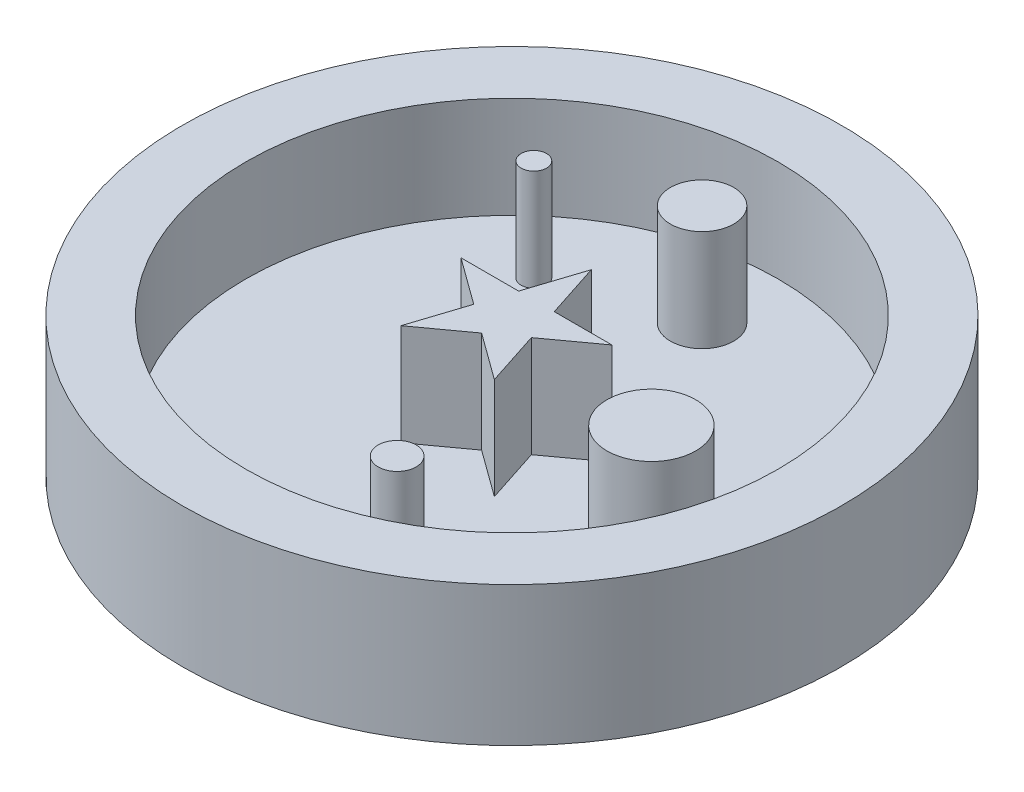
ISO-10303-21;
HEADER;
FILE_DESCRIPTION(('STEP AP214'),'2;1');
FILE_NAME('part.step','',(''),(''),'','','');
FILE_SCHEMA(('AUTOMOTIVE_DESIGN { 1 0 10303 214 1 1 1 1 }'));
ENDSEC;
DATA;
#1=APPLICATION_CONTEXT('core data for automotive mechanical design processes');
#2=APPLICATION_PROTOCOL_DEFINITION('international standard','automotive_design',2000,#1);
#3=PRODUCT_CONTEXT('',#1,'mechanical');
#4=PRODUCT('Part','Part','',(#3));
#5=PRODUCT_RELATED_PRODUCT_CATEGORY('part','',(#4));
#6=PRODUCT_DEFINITION_FORMATION('','',#4);
#7=PRODUCT_DEFINITION_CONTEXT('part definition',#1,'design');
#8=PRODUCT_DEFINITION('design','',#6,#7);
#9=PRODUCT_DEFINITION_SHAPE('','',#8);
#10=(LENGTH_UNIT() NAMED_UNIT(*) SI_UNIT(.MILLI.,.METRE.));
#11=(NAMED_UNIT(*) PLANE_ANGLE_UNIT() SI_UNIT($,.RADIAN.));
#12=(NAMED_UNIT(*) SI_UNIT($,.STERADIAN.) SOLID_ANGLE_UNIT());
#13=UNCERTAINTY_MEASURE_WITH_UNIT(LENGTH_MEASURE(1.E-05),#10,'distance_accuracy_value','');
#14=(GEOMETRIC_REPRESENTATION_CONTEXT(3) GLOBAL_UNCERTAINTY_ASSIGNED_CONTEXT((#13)) GLOBAL_UNIT_ASSIGNED_CONTEXT((#10,
#11,#12)) REPRESENTATION_CONTEXT('',''));
#15=CARTESIAN_POINT('',(0.,0.,0.));
#16=DIRECTION('',(0.,0.,1.));
#17=DIRECTION('',(1.,0.,0.));
#18=AXIS2_PLACEMENT_3D('',#15,#16,#17);
#19=CARTESIAN_POINT('',(0.,3.,0.));
#20=DIRECTION('',(0.,1.,0.));
#21=DIRECTION('',(0.,0.,1.));
#22=AXIS2_PLACEMENT_3D('',#19,#20,#21);
#23=PLANE('',#22);
#24=CARTESIAN_POINT('',(5.06448216423323,3.,14.1191720864987));
#25=DIRECTION('',(0.,1.,0.));
#26=DIRECTION('',(0.,0.,1.));
#27=AXIS2_PLACEMENT_3D('',#24,#25,#26);
#28=CIRCLE('',#27,1.5);
#29=CARTESIAN_POINT('',(5.06448216423323,3.,15.6191720864987));
#30=VERTEX_POINT('',#29);
#31=EDGE_CURVE('E296',#30,#30,#28,.T.);
#32=ORIENTED_EDGE('',*,*,#31,.F.);
#33=EDGE_LOOP('',(#32));
#34=FACE_BOUND('',#33,.T.);
#35=CARTESIAN_POINT('',(13.,3.,2.));
#36=DIRECTION('',(0.,1.,0.));
#37=DIRECTION('',(0.,0.,1.));
#38=AXIS2_PLACEMENT_3D('',#35,#36,#37);
#39=CIRCLE('',#38,3.5);
#40=CARTESIAN_POINT('',(13.,3.,5.5));
#41=VERTEX_POINT('',#40);
#42=EDGE_CURVE('E295',#41,#41,#39,.T.);
#43=ORIENTED_EDGE('',*,*,#42,.F.);
#44=EDGE_LOOP('',(#43));
#45=FACE_BOUND('',#44,.T.);
#46=CARTESIAN_POINT('',(0.,3.,-15.));
#47=DIRECTION('',(0.,1.,0.));
#48=DIRECTION('',(0.,0.,1.));
#49=AXIS2_PLACEMENT_3D('',#46,#47,#48);
#50=CIRCLE('',#49,2.5);
#51=CARTESIAN_POINT('',(0.,3.,-12.5));
#52=VERTEX_POINT('',#51);
#53=EDGE_CURVE('E305',#52,#52,#50,.T.);
#54=ORIENTED_EDGE('',*,*,#53,.F.);
#55=EDGE_LOOP('',(#54));
#56=FACE_BOUND('',#55,.T.);
#57=CARTESIAN_POINT('',(-9.70671974269708,3.,-11.4358905134989));
#58=DIRECTION('',(0.,1.,0.));
#59=DIRECTION('',(0.,0.,1.));
#60=AXIS2_PLACEMENT_3D('',#57,#58,#59);
#61=CIRCLE('',#60,1.);
#62=CARTESIAN_POINT('',(-9.70671974269708,3.,-10.4358905134989));
#63=VERTEX_POINT('',#62);
#64=EDGE_CURVE('E310',#63,#63,#61,.T.);
#65=ORIENTED_EDGE('',*,*,#64,.F.);
#66=EDGE_LOOP('',(#65));
#67=FACE_BOUND('',#66,.T.);
#68=CARTESIAN_POINT('',(0.,3.,0.));
#69=DIRECTION('',(0.,1.,0.));
#70=DIRECTION('',(0.,0.,1.));
#71=AXIS2_PLACEMENT_3D('',#68,#69,#70);
#72=CIRCLE('',#71,21.);
#73=CARTESIAN_POINT('',(0.,3.,21.));
#74=VERTEX_POINT('',#73);
#75=EDGE_CURVE('E189',#74,#74,#72,.T.);
#76=ORIENTED_EDGE('',*,*,#75,.T.);
#77=EDGE_LOOP('',(#76));
#78=FACE_BOUND('',#77,.T.);
#79=DIRECTION('',(-0.309016994374948,0.,0.951056516295153));
#80=VECTOR('',#79,1.);
#81=CARTESIAN_POINT('',(0.,3.,-6.26099033699941));
#82=LINE('',#81,#80);
#83=CARTESIAN_POINT('',(0.,3.,-6.26099033699941));
#84=VERTEX_POINT('',#83);
#85=CARTESIAN_POINT('',(-1.40567991120359,3.,-1.93475241575015));
#86=VERTEX_POINT('',#85);
#87=EDGE_CURVE('E150',#84,#86,#82,.T.);
#88=ORIENTED_EDGE('',*,*,#87,.F.);
#89=DIRECTION('',(-0.309016994374948,0.,-0.951056516295154));
#90=VECTOR('',#89,1.);
#91=CARTESIAN_POINT('',(1.40567991120359,3.,-1.93475241575015));
#92=LINE('',#91,#90);
#93=CARTESIAN_POINT('',(1.40567991120359,3.,-1.93475241575015));
#94=VERTEX_POINT('',#93);
#95=EDGE_CURVE('E147',#94,#84,#92,.T.);
#96=ORIENTED_EDGE('',*,*,#95,.F.);
#97=DIRECTION('',(-1.,0.,0.));
#98=VECTOR('',#97,1.);
#99=CARTESIAN_POINT('',(5.95455565846428,3.,-1.93475241575015));
#100=LINE('',#99,#98);
#101=CARTESIAN_POINT('',(5.95455565846428,3.,-1.93475241575015));
#102=VERTEX_POINT('',#101);
#103=EDGE_CURVE('E94',#102,#94,#100,.T.);
#104=ORIENTED_EDGE('',*,*,#103,.F.);
#105=DIRECTION('',(0.809016994374947,0.,-0.587785252292473));
#106=VECTOR('',#105,1.);
#107=CARTESIAN_POINT('',(2.27443787363034,3.,0.739009663000589));
#108=LINE('',#107,#106);
#109=CARTESIAN_POINT('',(2.27443787363034,3.,0.739009663000589));
#110=VERTEX_POINT('',#109);
#111=EDGE_CURVE('E164',#110,#102,#108,.T.);
#112=ORIENTED_EDGE('',*,*,#111,.F.);
#113=DIRECTION('',(-0.309016994374947,0.,-0.951056516295154));
#114=VECTOR('',#113,1.);
#115=CARTESIAN_POINT('',(3.68011778483393,3.,5.06524758424985));
#116=LINE('',#115,#114);
#117=CARTESIAN_POINT('',(3.68011778483393,3.,5.06524758424985));
#118=VERTEX_POINT('',#117);
#119=EDGE_CURVE('E136',#118,#110,#116,.T.);
#120=ORIENTED_EDGE('',*,*,#119,.F.);
#121=DIRECTION('',(0.809016994374947,0.,0.587785252292473));
#122=VECTOR('',#121,1.);
#123=CARTESIAN_POINT('',(0.,3.,2.39148550549912));
#124=LINE('',#123,#122);
#125=CARTESIAN_POINT('',(0.,3.,2.39148550549912));
#126=VERTEX_POINT('',#125);
#127=EDGE_CURVE('E161',#126,#118,#124,.T.);
#128=ORIENTED_EDGE('',*,*,#127,.F.);
#129=DIRECTION('',(0.809016994374947,0.,-0.587785252292473));
#130=VECTOR('',#129,1.);
#131=CARTESIAN_POINT('',(-3.68011778483394,3.,5.06524758424985));
#132=LINE('',#131,#130);
#133=CARTESIAN_POINT('',(-3.68011778483394,3.,5.06524758424985));
#134=VERTEX_POINT('',#133);
#135=EDGE_CURVE('E159',#134,#126,#132,.T.);
#136=ORIENTED_EDGE('',*,*,#135,.F.);
#137=DIRECTION('',(-0.309016994374948,0.,0.951056516295154));
#138=VECTOR('',#137,1.);
#139=CARTESIAN_POINT('',(-2.27443787363035,3.,0.739009663000588));
#140=LINE('',#139,#138);
#141=CARTESIAN_POINT('',(-2.27443787363035,3.,0.739009663000588));
#142=VERTEX_POINT('',#141);
#143=EDGE_CURVE('E157',#142,#134,#140,.T.);
#144=ORIENTED_EDGE('',*,*,#143,.F.);
#145=DIRECTION('',(0.809016994374947,0.,0.587785252292473));
#146=VECTOR('',#145,1.);
#147=CARTESIAN_POINT('',(-5.95455565846428,3.,-1.93475241575015));
#148=LINE('',#147,#146);
#149=CARTESIAN_POINT('',(-5.95455565846428,3.,-1.93475241575015));
#150=VERTEX_POINT('',#149);
#151=EDGE_CURVE('E155',#150,#142,#148,.T.);
#152=ORIENTED_EDGE('',*,*,#151,.F.);
#153=DIRECTION('',(-1.,0.,0.));
#154=VECTOR('',#153,1.);
#155=CARTESIAN_POINT('',(-1.40567991120359,3.,-1.93475241575015));
#156=LINE('',#155,#154);
#157=EDGE_CURVE('E153',#86,#150,#156,.T.);
#158=ORIENTED_EDGE('',*,*,#157,.F.);
#159=EDGE_LOOP('',(#88,#96,#104,#112,#120,#128,#136,#144,#152,#158));
#160=FACE_BOUND('',#159,.T.);
#161=ADVANCED_FACE('F39',(#34,#45,#56,#67,#78,#160),#23,.T.);
#162=CARTESIAN_POINT('',(0.,11.,0.));
#163=DIRECTION('',(0.,-1.,0.));
#164=DIRECTION('',(0.,0.,-1.));
#165=AXIS2_PLACEMENT_3D('',#162,#163,#164);
#166=CYLINDRICAL_SURFACE('',#165,26.);
#167=CARTESIAN_POINT('',(0.,11.,0.));
#168=DIRECTION('',(0.,1.,0.));
#169=DIRECTION('',(0.,0.,1.));
#170=AXIS2_PLACEMENT_3D('',#167,#168,#169);
#171=CIRCLE('',#170,26.);
#172=CARTESIAN_POINT('',(0.,11.,26.));
#173=VERTEX_POINT('',#172);
#174=EDGE_CURVE('E11',#173,#173,#171,.T.);
#175=ORIENTED_EDGE('',*,*,#174,.F.);
#176=EDGE_LOOP('',(#175));
#177=FACE_BOUND('',#176,.T.);
#178=CARTESIAN_POINT('',(0.,0.,0.));
#179=DIRECTION('',(0.,1.,0.));
#180=DIRECTION('',(0.,0.,1.));
#181=AXIS2_PLACEMENT_3D('',#178,#179,#180);
#182=CIRCLE('',#181,26.);
#183=CARTESIAN_POINT('',(0.,0.,26.));
#184=VERTEX_POINT('',#183);
#185=EDGE_CURVE('E43',#184,#184,#182,.T.);
#186=ORIENTED_EDGE('',*,*,#185,.T.);
#187=EDGE_LOOP('',(#186));
#188=FACE_BOUND('',#187,.T.);
#189=ADVANCED_FACE('F41',(#177,#188),#166,.T.);
#190=CARTESIAN_POINT('',(0.,11.,0.));
#191=DIRECTION('',(0.,1.,0.));
#192=DIRECTION('',(0.,0.,1.));
#193=AXIS2_PLACEMENT_3D('',#190,#191,#192);
#194=PLANE('',#193);
#195=CARTESIAN_POINT('',(0.,11.,0.));
#196=DIRECTION('',(0.,1.,0.));
#197=DIRECTION('',(0.,0.,1.));
#198=AXIS2_PLACEMENT_3D('',#195,#196,#197);
#199=CIRCLE('',#198,21.);
#200=CARTESIAN_POINT('',(0.,11.,21.));
#201=VERTEX_POINT('',#200);
#202=EDGE_CURVE('E188',#201,#201,#199,.T.);
#203=ORIENTED_EDGE('',*,*,#202,.F.);
#204=EDGE_LOOP('',(#203));
#205=FACE_BOUND('',#204,.T.);
#206=ORIENTED_EDGE('',*,*,#174,.T.);
#207=EDGE_LOOP('',(#206));
#208=FACE_BOUND('',#207,.T.);
#209=ADVANCED_FACE('F197',(#205,#208),#194,.T.);
#210=CARTESIAN_POINT('',(0.,0.,0.));
#211=DIRECTION('',(0.,1.,0.));
#212=DIRECTION('',(0.,0.,1.));
#213=AXIS2_PLACEMENT_3D('',#210,#211,#212);
#214=PLANE('',#213);
#215=ORIENTED_EDGE('',*,*,#185,.F.);
#216=EDGE_LOOP('',(#215));
#217=FACE_BOUND('',#216,.T.);
#218=ADVANCED_FACE('F200',(#217),#214,.F.);
#219=CARTESIAN_POINT('',(0.,3.,0.));
#220=DIRECTION('',(0.,1.,0.));
#221=DIRECTION('',(0.,0.,1.));
#222=AXIS2_PLACEMENT_3D('',#219,#220,#221);
#223=CYLINDRICAL_SURFACE('',#222,21.);
#224=ORIENTED_EDGE('',*,*,#75,.F.);
#225=EDGE_LOOP('',(#224));
#226=FACE_BOUND('',#225,.T.);
#227=ORIENTED_EDGE('',*,*,#202,.T.);
#228=EDGE_LOOP('',(#227));
#229=FACE_BOUND('',#228,.T.);
#230=ADVANCED_FACE('F195',(#226,#229),#223,.F.);
#231=CARTESIAN_POINT('',(1.40567991120359,11.,-1.93475241575015));
#232=DIRECTION('',(-0.951056516295154,0.,0.309016994374948));
#233=DIRECTION('',(0.309016994374948,0.,0.951056516295154));
#234=AXIS2_PLACEMENT_3D('',#231,#232,#233);
#235=PLANE('',#234);
#236=ORIENTED_EDGE('',*,*,#95,.T.);
#237=DIRECTION('',(0.,-1.,0.));
#238=VECTOR('',#237,1.);
#239=CARTESIAN_POINT('',(0.,11.,-6.26099033699941));
#240=LINE('',#239,#238);
#241=CARTESIAN_POINT('',(0.,11.,-6.26099033699941));
#242=VERTEX_POINT('',#241);
#243=EDGE_CURVE('E186',#242,#84,#240,.T.);
#244=ORIENTED_EDGE('',*,*,#243,.F.);
#245=DIRECTION('',(-0.309016994374948,0.,-0.951056516295154));
#246=VECTOR('',#245,1.);
#247=CARTESIAN_POINT('',(1.40567991120359,11.,-1.93475241575015));
#248=LINE('',#247,#246);
#249=CARTESIAN_POINT('',(1.40567991120359,11.,-1.93475241575015));
#250=VERTEX_POINT('',#249);
#251=EDGE_CURVE('E167',#250,#242,#248,.T.);
#252=ORIENTED_EDGE('',*,*,#251,.F.);
#253=DIRECTION('',(0.,-1.,0.));
#254=VECTOR('',#253,1.);
#255=CARTESIAN_POINT('',(1.40567991120359,11.,-1.93475241575015));
#256=LINE('',#255,#254);
#257=EDGE_CURVE('E143',#250,#94,#256,.T.);
#258=ORIENTED_EDGE('',*,*,#257,.T.);
#259=EDGE_LOOP('',(#236,#244,#252,#258));
#260=FACE_BOUND('',#259,.T.);
#261=ADVANCED_FACE('F213',(#260),#235,.F.);
#262=CARTESIAN_POINT('',(0.,11.,-6.26099033699941));
#263=DIRECTION('',(0.951056516295154,0.,0.309016994374948));
#264=DIRECTION('',(0.309016994374948,0.,-0.951056516295154));
#265=AXIS2_PLACEMENT_3D('',#262,#263,#264);
#266=PLANE('',#265);
#267=ORIENTED_EDGE('',*,*,#87,.T.);
#268=DIRECTION('',(0.,-1.,0.));
#269=VECTOR('',#268,1.);
#270=CARTESIAN_POINT('',(-1.40567991120359,11.,-1.93475241575015));
#271=LINE('',#270,#269);
#272=CARTESIAN_POINT('',(-1.40567991120359,11.,-1.93475241575015));
#273=VERTEX_POINT('',#272);
#274=EDGE_CURVE('E183',#273,#86,#271,.T.);
#275=ORIENTED_EDGE('',*,*,#274,.F.);
#276=DIRECTION('',(-0.309016994374948,0.,0.951056516295153));
#277=VECTOR('',#276,1.);
#278=CARTESIAN_POINT('',(0.,11.,-6.26099033699941));
#279=LINE('',#278,#277);
#280=EDGE_CURVE('E102',#242,#273,#279,.T.);
#281=ORIENTED_EDGE('',*,*,#280,.F.);
#282=ORIENTED_EDGE('',*,*,#243,.T.);
#283=EDGE_LOOP('',(#267,#275,#281,#282));
#284=FACE_BOUND('',#283,.T.);
#285=ADVANCED_FACE('F226',(#284),#266,.F.);
#286=CARTESIAN_POINT('',(-1.40567991120359,11.,-1.93475241575015));
#287=DIRECTION('',(0.,0.,1.));
#288=DIRECTION('',(1.,0.,0.));
#289=AXIS2_PLACEMENT_3D('',#286,#287,#288);
#290=PLANE('',#289);
#291=ORIENTED_EDGE('',*,*,#157,.T.);
#292=DIRECTION('',(0.,-1.,0.));
#293=VECTOR('',#292,1.);
#294=CARTESIAN_POINT('',(-5.95455565846428,11.,-1.93475241575015));
#295=LINE('',#294,#293);
#296=CARTESIAN_POINT('',(-5.95455565846428,11.,-1.93475241575015));
#297=VERTEX_POINT('',#296);
#298=EDGE_CURVE('E180',#297,#150,#295,.T.);
#299=ORIENTED_EDGE('',*,*,#298,.F.);
#300=DIRECTION('',(-1.,0.,0.));
#301=VECTOR('',#300,1.);
#302=CARTESIAN_POINT('',(-1.40567991120359,11.,-1.93475241575015));
#303=LINE('',#302,#301);
#304=EDGE_CURVE('E319',#273,#297,#303,.T.);
#305=ORIENTED_EDGE('',*,*,#304,.F.);
#306=ORIENTED_EDGE('',*,*,#274,.T.);
#307=EDGE_LOOP('',(#291,#299,#305,#306));
#308=FACE_BOUND('',#307,.T.);
#309=ADVANCED_FACE('F230',(#308),#290,.F.);
#310=CARTESIAN_POINT('',(-5.95455565846428,11.,-1.93475241575015));
#311=DIRECTION('',(0.587785252292473,0.,-0.809016994374947));
#312=DIRECTION('',(-0.809016994374947,0.,-0.587785252292473));
#313=AXIS2_PLACEMENT_3D('',#310,#311,#312);
#314=PLANE('',#313);
#315=ORIENTED_EDGE('',*,*,#151,.T.);
#316=DIRECTION('',(0.,-1.,0.));
#317=VECTOR('',#316,1.);
#318=CARTESIAN_POINT('',(-2.27443787363035,11.,0.739009663000588));
#319=LINE('',#318,#317);
#320=CARTESIAN_POINT('',(-2.27443787363035,11.,0.739009663000588));
#321=VERTEX_POINT('',#320);
#322=EDGE_CURVE('E177',#321,#142,#319,.T.);
#323=ORIENTED_EDGE('',*,*,#322,.F.);
#324=DIRECTION('',(0.809016994374947,0.,0.587785252292473));
#325=VECTOR('',#324,1.);
#326=CARTESIAN_POINT('',(-5.95455565846428,11.,-1.93475241575015));
#327=LINE('',#326,#325);
#328=EDGE_CURVE('E321',#297,#321,#327,.T.);
#329=ORIENTED_EDGE('',*,*,#328,.F.);
#330=ORIENTED_EDGE('',*,*,#298,.T.);
#331=EDGE_LOOP('',(#315,#323,#329,#330));
#332=FACE_BOUND('',#331,.T.);
#333=ADVANCED_FACE('F233',(#332),#314,.F.);
#334=CARTESIAN_POINT('',(-2.27443787363035,11.,0.739009663000588));
#335=DIRECTION('',(0.951056516295154,0.,0.309016994374948));
#336=DIRECTION('',(0.309016994374948,0.,-0.951056516295154));
#337=AXIS2_PLACEMENT_3D('',#334,#335,#336);
#338=PLANE('',#337);
#339=ORIENTED_EDGE('',*,*,#143,.T.);
#340=DIRECTION('',(0.,-1.,0.));
#341=VECTOR('',#340,1.);
#342=CARTESIAN_POINT('',(-3.68011778483394,11.,5.06524758424985));
#343=LINE('',#342,#341);
#344=CARTESIAN_POINT('',(-3.68011778483394,11.,5.06524758424985));
#345=VERTEX_POINT('',#344);
#346=EDGE_CURVE('E174',#345,#134,#343,.T.);
#347=ORIENTED_EDGE('',*,*,#346,.F.);
#348=DIRECTION('',(-0.309016994374948,0.,0.951056516295154));
#349=VECTOR('',#348,1.);
#350=CARTESIAN_POINT('',(-2.27443787363035,11.,0.739009663000588));
#351=LINE('',#350,#349);
#352=EDGE_CURVE('E323',#321,#345,#351,.T.);
#353=ORIENTED_EDGE('',*,*,#352,.F.);
#354=ORIENTED_EDGE('',*,*,#322,.T.);
#355=EDGE_LOOP('',(#339,#347,#353,#354));
#356=FACE_BOUND('',#355,.T.);
#357=ADVANCED_FACE('F237',(#356),#338,.F.);
#358=CARTESIAN_POINT('',(-3.68011778483394,11.,5.06524758424985));
#359=DIRECTION('',(-0.587785252292473,0.,-0.809016994374947));
#360=DIRECTION('',(-0.809016994374947,0.,0.587785252292473));
#361=AXIS2_PLACEMENT_3D('',#358,#359,#360);
#362=PLANE('',#361);
#363=ORIENTED_EDGE('',*,*,#135,.T.);
#364=DIRECTION('',(0.,-1.,0.));
#365=VECTOR('',#364,1.);
#366=CARTESIAN_POINT('',(0.,11.,2.39148550549912));
#367=LINE('',#366,#365);
#368=CARTESIAN_POINT('',(0.,11.,2.39148550549912));
#369=VERTEX_POINT('',#368);
#370=EDGE_CURVE('E171',#369,#126,#367,.T.);
#371=ORIENTED_EDGE('',*,*,#370,.F.);
#372=DIRECTION('',(0.809016994374947,0.,-0.587785252292473));
#373=VECTOR('',#372,1.);
#374=CARTESIAN_POINT('',(-3.68011778483394,11.,5.06524758424985));
#375=LINE('',#374,#373);
#376=EDGE_CURVE('E325',#345,#369,#375,.T.);
#377=ORIENTED_EDGE('',*,*,#376,.F.);
#378=ORIENTED_EDGE('',*,*,#346,.T.);
#379=EDGE_LOOP('',(#363,#371,#377,#378));
#380=FACE_BOUND('',#379,.T.);
#381=ADVANCED_FACE('F241',(#380),#362,.F.);
#382=CARTESIAN_POINT('',(0.,11.,2.39148550549912));
#383=DIRECTION('',(0.587785252292473,0.,-0.809016994374947));
#384=DIRECTION('',(-0.809016994374947,0.,-0.587785252292473));
#385=AXIS2_PLACEMENT_3D('',#382,#383,#384);
#386=PLANE('',#385);
#387=ORIENTED_EDGE('',*,*,#127,.T.);
#388=DIRECTION('',(0.,-1.,0.));
#389=VECTOR('',#388,1.);
#390=CARTESIAN_POINT('',(3.68011778483393,11.,5.06524758424985));
#391=LINE('',#390,#389);
#392=CARTESIAN_POINT('',(3.68011778483393,11.,5.06524758424985));
#393=VERTEX_POINT('',#392);
#394=EDGE_CURVE('E139',#393,#118,#391,.T.);
#395=ORIENTED_EDGE('',*,*,#394,.F.);
#396=DIRECTION('',(0.809016994374947,0.,0.587785252292473));
#397=VECTOR('',#396,1.);
#398=CARTESIAN_POINT('',(0.,11.,2.39148550549912));
#399=LINE('',#398,#397);
#400=EDGE_CURVE('E127',#369,#393,#399,.T.);
#401=ORIENTED_EDGE('',*,*,#400,.F.);
#402=ORIENTED_EDGE('',*,*,#370,.T.);
#403=EDGE_LOOP('',(#387,#395,#401,#402));
#404=FACE_BOUND('',#403,.T.);
#405=ADVANCED_FACE('F245',(#404),#386,.F.);
#406=CARTESIAN_POINT('',(3.68011778483393,11.,5.06524758424985));
#407=DIRECTION('',(-0.951056516295154,0.,0.309016994374947));
#408=DIRECTION('',(0.309016994374947,0.,0.951056516295154));
#409=AXIS2_PLACEMENT_3D('',#406,#407,#408);
#410=PLANE('',#409);
#411=ORIENTED_EDGE('',*,*,#119,.T.);
#412=DIRECTION('',(0.,-1.,0.));
#413=VECTOR('',#412,1.);
#414=CARTESIAN_POINT('',(2.27443787363034,11.,0.739009663000589));
#415=LINE('',#414,#413);
#416=CARTESIAN_POINT('',(2.27443787363034,11.,0.739009663000589));
#417=VERTEX_POINT('',#416);
#418=EDGE_CURVE('E133',#417,#110,#415,.T.);
#419=ORIENTED_EDGE('',*,*,#418,.F.);
#420=DIRECTION('',(-0.309016994374947,0.,-0.951056516295154));
#421=VECTOR('',#420,1.);
#422=CARTESIAN_POINT('',(3.68011778483393,11.,5.06524758424985));
#423=LINE('',#422,#421);
#424=EDGE_CURVE('E121',#393,#417,#423,.T.);
#425=ORIENTED_EDGE('',*,*,#424,.F.);
#426=ORIENTED_EDGE('',*,*,#394,.T.);
#427=EDGE_LOOP('',(#411,#419,#425,#426));
#428=FACE_BOUND('',#427,.T.);
#429=ADVANCED_FACE('F134',(#428),#410,.F.);
#430=CARTESIAN_POINT('',(2.27443787363034,11.,0.739009663000589));
#431=DIRECTION('',(-0.587785252292473,0.,-0.809016994374947));
#432=DIRECTION('',(-0.809016994374947,0.,0.587785252292473));
#433=AXIS2_PLACEMENT_3D('',#430,#431,#432);
#434=PLANE('',#433);
#435=ORIENTED_EDGE('',*,*,#111,.T.);
#436=DIRECTION('',(0.,-1.,0.));
#437=VECTOR('',#436,1.);
#438=CARTESIAN_POINT('',(5.95455565846428,11.,-1.93475241575015));
#439=LINE('',#438,#437);
#440=CARTESIAN_POINT('',(5.95455565846428,11.,-1.93475241575015));
#441=VERTEX_POINT('',#440);
#442=EDGE_CURVE('E54',#441,#102,#439,.T.);
#443=ORIENTED_EDGE('',*,*,#442,.F.);
#444=DIRECTION('',(0.809016994374947,0.,-0.587785252292473));
#445=VECTOR('',#444,1.);
#446=CARTESIAN_POINT('',(2.27443787363034,11.,0.739009663000589));
#447=LINE('',#446,#445);
#448=EDGE_CURVE('E125',#417,#441,#447,.T.);
#449=ORIENTED_EDGE('',*,*,#448,.F.);
#450=ORIENTED_EDGE('',*,*,#418,.T.);
#451=EDGE_LOOP('',(#435,#443,#449,#450));
#452=FACE_BOUND('',#451,.T.);
#453=ADVANCED_FACE('F141',(#452),#434,.F.);
#454=CARTESIAN_POINT('',(5.95455565846428,11.,-1.93475241575015));
#455=DIRECTION('',(0.,0.,1.));
#456=DIRECTION('',(1.,0.,0.));
#457=AXIS2_PLACEMENT_3D('',#454,#455,#456);
#458=PLANE('',#457);
#459=ORIENTED_EDGE('',*,*,#103,.T.);
#460=ORIENTED_EDGE('',*,*,#257,.F.);
#461=DIRECTION('',(-1.,0.,0.));
#462=VECTOR('',#461,1.);
#463=CARTESIAN_POINT('',(5.95455565846428,11.,-1.93475241575015));
#464=LINE('',#463,#462);
#465=EDGE_CURVE('E62',#441,#250,#464,.T.);
#466=ORIENTED_EDGE('',*,*,#465,.F.);
#467=ORIENTED_EDGE('',*,*,#442,.T.);
#468=EDGE_LOOP('',(#459,#460,#466,#467));
#469=FACE_BOUND('',#468,.T.);
#470=ADVANCED_FACE('F254',(#469),#458,.F.);
#471=CARTESIAN_POINT('',(0.,11.,0.));
#472=DIRECTION('',(0.,1.,0.));
#473=DIRECTION('',(0.,0.,1.));
#474=AXIS2_PLACEMENT_3D('',#471,#472,#473);
#475=PLANE('',#474);
#476=ORIENTED_EDGE('',*,*,#251,.T.);
#477=ORIENTED_EDGE('',*,*,#280,.T.);
#478=ORIENTED_EDGE('',*,*,#304,.T.);
#479=ORIENTED_EDGE('',*,*,#328,.T.);
#480=ORIENTED_EDGE('',*,*,#352,.T.);
#481=ORIENTED_EDGE('',*,*,#376,.T.);
#482=ORIENTED_EDGE('',*,*,#400,.T.);
#483=ORIENTED_EDGE('',*,*,#424,.T.);
#484=ORIENTED_EDGE('',*,*,#448,.T.);
#485=ORIENTED_EDGE('',*,*,#465,.T.);
#486=EDGE_LOOP('',(#476,#477,#478,#479,#480,#481,#482,#483,#484,#485));
#487=FACE_BOUND('',#486,.T.);
#488=ADVANCED_FACE('F123',(#487),#475,.T.);
#489=CARTESIAN_POINT('',(-9.70671974269708,11.,-11.4358905134989));
#490=DIRECTION('',(0.,-1.,0.));
#491=DIRECTION('',(0.,0.,-1.));
#492=AXIS2_PLACEMENT_3D('',#489,#490,#491);
#493=CYLINDRICAL_SURFACE('',#492,1.);
#494=CARTESIAN_POINT('',(-9.70671974269708,11.,-11.4358905134989));
#495=DIRECTION('',(0.,1.,0.));
#496=DIRECTION('',(0.,0.,1.));
#497=AXIS2_PLACEMENT_3D('',#494,#495,#496);
#498=CIRCLE('',#497,1.);
#499=CARTESIAN_POINT('',(-9.70671974269708,11.,-10.4358905134989));
#500=VERTEX_POINT('',#499);
#501=EDGE_CURVE('E151',#500,#500,#498,.T.);
#502=ORIENTED_EDGE('',*,*,#501,.F.);
#503=EDGE_LOOP('',(#502));
#504=FACE_BOUND('',#503,.T.);
#505=ORIENTED_EDGE('',*,*,#64,.T.);
#506=EDGE_LOOP('',(#505));
#507=FACE_BOUND('',#506,.T.);
#508=ADVANCED_FACE('F259',(#504,#507),#493,.T.);
#509=CARTESIAN_POINT('',(-9.70671974269708,11.,-11.4358905134989));
#510=DIRECTION('',(0.,1.,0.));
#511=DIRECTION('',(0.,0.,1.));
#512=AXIS2_PLACEMENT_3D('',#509,#510,#511);
#513=PLANE('',#512);
#514=ORIENTED_EDGE('',*,*,#501,.T.);
#515=EDGE_LOOP('',(#514));
#516=FACE_BOUND('',#515,.T.);
#517=ADVANCED_FACE('F262',(#516),#513,.T.);
#518=CARTESIAN_POINT('',(0.,11.,-15.));
#519=DIRECTION('',(0.,-1.,0.));
#520=DIRECTION('',(0.,0.,-1.));
#521=AXIS2_PLACEMENT_3D('',#518,#519,#520);
#522=CYLINDRICAL_SURFACE('',#521,2.5);
#523=CARTESIAN_POINT('',(0.,11.,-15.));
#524=DIRECTION('',(0.,1.,0.));
#525=DIRECTION('',(0.,0.,1.));
#526=AXIS2_PLACEMENT_3D('',#523,#524,#525);
#527=CIRCLE('',#526,2.5);
#528=CARTESIAN_POINT('',(0.,11.,-12.5));
#529=VERTEX_POINT('',#528);
#530=EDGE_CURVE('E307',#529,#529,#527,.T.);
#531=ORIENTED_EDGE('',*,*,#530,.F.);
#532=EDGE_LOOP('',(#531));
#533=FACE_BOUND('',#532,.T.);
#534=ORIENTED_EDGE('',*,*,#53,.T.);
#535=EDGE_LOOP('',(#534));
#536=FACE_BOUND('',#535,.T.);
#537=ADVANCED_FACE('F266',(#533,#536),#522,.T.);
#538=CARTESIAN_POINT('',(0.,11.,-15.));
#539=DIRECTION('',(0.,1.,0.));
#540=DIRECTION('',(0.,0.,1.));
#541=AXIS2_PLACEMENT_3D('',#538,#539,#540);
#542=PLANE('',#541);
#543=ORIENTED_EDGE('',*,*,#530,.T.);
#544=EDGE_LOOP('',(#543));
#545=FACE_BOUND('',#544,.T.);
#546=ADVANCED_FACE('F270',(#545),#542,.T.);
#547=CARTESIAN_POINT('',(13.,11.,2.));
#548=DIRECTION('',(0.,-1.,0.));
#549=DIRECTION('',(0.,0.,-1.));
#550=AXIS2_PLACEMENT_3D('',#547,#548,#549);
#551=CYLINDRICAL_SURFACE('',#550,3.5);
#552=CARTESIAN_POINT('',(13.,11.,2.));
#553=DIRECTION('',(0.,1.,0.));
#554=DIRECTION('',(0.,0.,1.));
#555=AXIS2_PLACEMENT_3D('',#552,#553,#554);
#556=CIRCLE('',#555,3.5);
#557=CARTESIAN_POINT('',(13.,11.,5.5));
#558=VERTEX_POINT('',#557);
#559=EDGE_CURVE('E299',#558,#558,#556,.T.);
#560=ORIENTED_EDGE('',*,*,#559,.F.);
#561=EDGE_LOOP('',(#560));
#562=FACE_BOUND('',#561,.T.);
#563=ORIENTED_EDGE('',*,*,#42,.T.);
#564=EDGE_LOOP('',(#563));
#565=FACE_BOUND('',#564,.T.);
#566=ADVANCED_FACE('F274',(#562,#565),#551,.T.);
#567=CARTESIAN_POINT('',(13.,11.,2.));
#568=DIRECTION('',(0.,1.,0.));
#569=DIRECTION('',(0.,0.,1.));
#570=AXIS2_PLACEMENT_3D('',#567,#568,#569);
#571=PLANE('',#570);
#572=ORIENTED_EDGE('',*,*,#559,.T.);
#573=EDGE_LOOP('',(#572));
#574=FACE_BOUND('',#573,.T.);
#575=ADVANCED_FACE('F278',(#574),#571,.T.);
#576=CARTESIAN_POINT('',(5.06448216423323,11.,14.1191720864987));
#577=DIRECTION('',(0.,-1.,0.));
#578=DIRECTION('',(0.,0.,-1.));
#579=AXIS2_PLACEMENT_3D('',#576,#577,#578);
#580=CYLINDRICAL_SURFACE('',#579,1.5);
#581=CARTESIAN_POINT('',(5.06448216423323,11.,14.1191720864987));
#582=DIRECTION('',(0.,1.,0.));
#583=DIRECTION('',(0.,0.,1.));
#584=AXIS2_PLACEMENT_3D('',#581,#582,#583);
#585=CIRCLE('',#584,1.5);
#586=CARTESIAN_POINT('',(5.06448216423323,11.,15.6191720864987));
#587=VERTEX_POINT('',#586);
#588=EDGE_CURVE('E294',#587,#587,#585,.T.);
#589=ORIENTED_EDGE('',*,*,#588,.F.);
#590=EDGE_LOOP('',(#589));
#591=FACE_BOUND('',#590,.T.);
#592=ORIENTED_EDGE('',*,*,#31,.T.);
#593=EDGE_LOOP('',(#592));
#594=FACE_BOUND('',#593,.T.);
#595=ADVANCED_FACE('F282',(#591,#594),#580,.T.);
#596=CARTESIAN_POINT('',(5.06448216423323,11.,14.1191720864987));
#597=DIRECTION('',(0.,1.,0.));
#598=DIRECTION('',(0.,0.,1.));
#599=AXIS2_PLACEMENT_3D('',#596,#597,#598);
#600=PLANE('',#599);
#601=ORIENTED_EDGE('',*,*,#588,.T.);
#602=EDGE_LOOP('',(#601));
#603=FACE_BOUND('',#602,.T.);
#604=ADVANCED_FACE('F286',(#603),#600,.T.);
#605=CLOSED_SHELL('',(#161,#189,#209,#218,#230,#261,#285,#309,#333,#357,#381,#405,#429,#453,
#470,#488,#508,#517,#537,#546,#566,#575,#595,#604));
#606=MANIFOLD_SOLID_BREP('B2',#605);
#607=ADVANCED_BREP_SHAPE_REPRESENTATION('',(#18,#606),#14);
#608=SHAPE_DEFINITION_REPRESENTATION(#9,#607);
ENDSEC;
END-ISO-10303-21;
